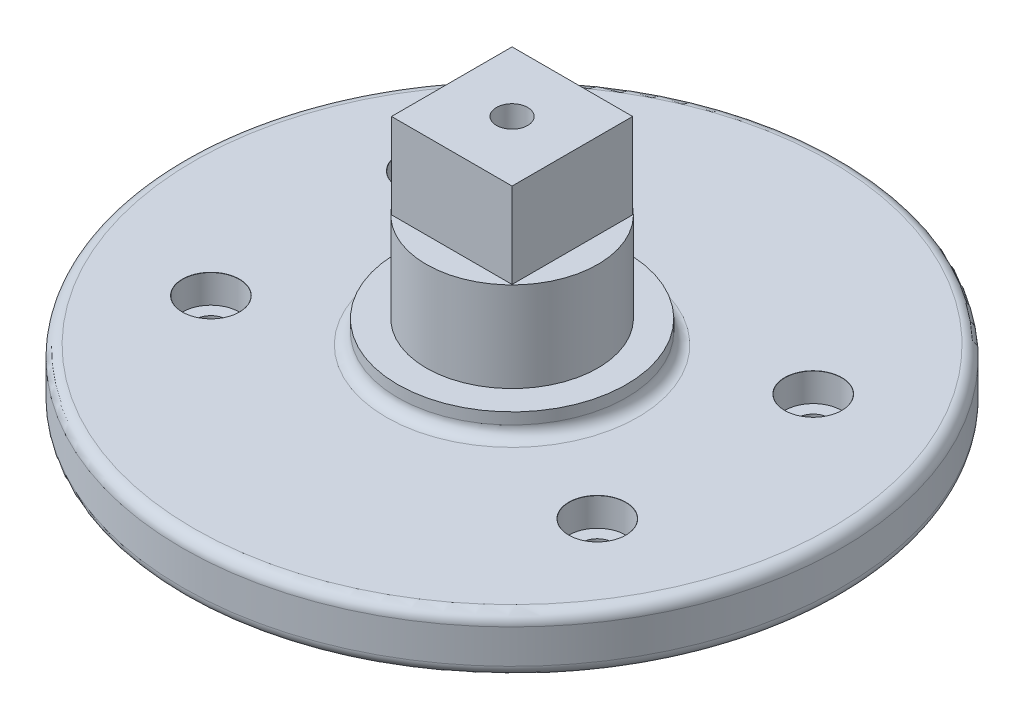
ISO-10303-21;
HEADER;
FILE_DESCRIPTION(('STEP AP214'),'2;1');
FILE_NAME('part.step','',(''),(''),'','','');
FILE_SCHEMA(('AUTOMOTIVE_DESIGN { 1 0 10303 214 1 1 1 1 }'));
ENDSEC;
DATA;
#1=APPLICATION_CONTEXT('core data for automotive mechanical design processes');
#2=APPLICATION_PROTOCOL_DEFINITION('international standard','automotive_design',2000,#1);
#3=PRODUCT_CONTEXT('',#1,'mechanical');
#4=PRODUCT('Part','Part','',(#3));
#5=PRODUCT_RELATED_PRODUCT_CATEGORY('part','',(#4));
#6=PRODUCT_DEFINITION_FORMATION('','',#4);
#7=PRODUCT_DEFINITION_CONTEXT('part definition',#1,'design');
#8=PRODUCT_DEFINITION('design','',#6,#7);
#9=PRODUCT_DEFINITION_SHAPE('','',#8);
#10=(LENGTH_UNIT() NAMED_UNIT(*) SI_UNIT(.MILLI.,.METRE.));
#11=(NAMED_UNIT(*) PLANE_ANGLE_UNIT() SI_UNIT($,.RADIAN.));
#12=(NAMED_UNIT(*) SI_UNIT($,.STERADIAN.) SOLID_ANGLE_UNIT());
#13=UNCERTAINTY_MEASURE_WITH_UNIT(LENGTH_MEASURE(1.E-05),#10,'distance_accuracy_value','');
#14=(GEOMETRIC_REPRESENTATION_CONTEXT(3) GLOBAL_UNCERTAINTY_ASSIGNED_CONTEXT((#13)) GLOBAL_UNIT_ASSIGNED_CONTEXT((#10,
#11,#12)) REPRESENTATION_CONTEXT('',''));
#15=CARTESIAN_POINT('',(0.,0.,0.));
#16=DIRECTION('',(0.,0.,1.));
#17=DIRECTION('',(1.,0.,0.));
#18=AXIS2_PLACEMENT_3D('',#15,#16,#17);
#19=CARTESIAN_POINT('',(0.,0.,0.));
#20=DIRECTION('',(0.,-1.,0.));
#21=DIRECTION('',(0.,0.,-1.));
#22=AXIS2_PLACEMENT_3D('',#19,#20,#21);
#23=CYLINDRICAL_SURFACE('',#22,2.74999999999999);
#24=CARTESIAN_POINT('',(0.,44.8,0.));
#25=DIRECTION('',(0.,-1.,0.));
#26=DIRECTION('',(0.,0.,-1.));
#27=AXIS2_PLACEMENT_3D('',#24,#25,#26);
#28=CIRCLE('',#27,2.74999999999999);
#29=CARTESIAN_POINT('',(0.,44.8,-2.74999999999999));
#30=VERTEX_POINT('',#29);
#31=EDGE_CURVE('E195',#30,#30,#28,.T.);
#32=ORIENTED_EDGE('',*,*,#31,.F.);
#33=EDGE_LOOP('',(#32));
#34=FACE_BOUND('',#33,.T.);
#35=CARTESIAN_POINT('',(0.,3.8,0.));
#36=DIRECTION('',(0.,-1.,0.));
#37=DIRECTION('',(0.,0.,-1.));
#38=AXIS2_PLACEMENT_3D('',#35,#36,#37);
#39=CIRCLE('',#38,2.74999999999999);
#40=CARTESIAN_POINT('',(0.,3.8,-2.74999999999999));
#41=VERTEX_POINT('',#40);
#42=EDGE_CURVE('E47',#41,#41,#39,.F.);
#43=ORIENTED_EDGE('',*,*,#42,.F.);
#44=EDGE_LOOP('',(#43));
#45=FACE_BOUND('',#44,.T.);
#46=ADVANCED_FACE('F43',(#34,#45),#23,.F.);
#47=CARTESIAN_POINT('',(0.,0.,0.));
#48=DIRECTION('',(0.,1.,0.));
#49=DIRECTION('',(0.,0.,1.));
#50=AXIS2_PLACEMENT_3D('',#47,#48,#49);
#51=PLANE('',#50);
#52=DIRECTION('',(-1.,0.,0.));
#53=VECTOR('',#52,1.);
#54=CARTESIAN_POINT('',(2.36713610367746,0.,4.1));
#55=LINE('',#54,#53);
#56=CARTESIAN_POINT('',(2.36713610367746,0.,4.1));
#57=VERTEX_POINT('',#56);
#58=CARTESIAN_POINT('',(-2.36713610367746,0.,4.1));
#59=VERTEX_POINT('',#58);
#60=EDGE_CURVE('E167',#57,#59,#55,.T.);
#61=ORIENTED_EDGE('',*,*,#60,.F.);
#62=DIRECTION('',(-0.5,0.,0.866025403784439));
#63=VECTOR('',#62,1.);
#64=CARTESIAN_POINT('',(4.73427220735493,0.,0.));
#65=LINE('',#64,#63);
#66=CARTESIAN_POINT('',(4.73427220735493,0.,0.));
#67=VERTEX_POINT('',#66);
#68=EDGE_CURVE('E60',#67,#57,#65,.T.);
#69=ORIENTED_EDGE('',*,*,#68,.F.);
#70=DIRECTION('',(0.5,0.,0.866025403784438));
#71=VECTOR('',#70,1.);
#72=CARTESIAN_POINT('',(2.36713610367746,0.,-4.1));
#73=LINE('',#72,#71);
#74=CARTESIAN_POINT('',(2.36713610367746,0.,-4.1));
#75=VERTEX_POINT('',#74);
#76=EDGE_CURVE('E147',#75,#67,#73,.T.);
#77=ORIENTED_EDGE('',*,*,#76,.F.);
#78=DIRECTION('',(1.,0.,0.));
#79=VECTOR('',#78,1.);
#80=CARTESIAN_POINT('',(-2.36713610367746,0.,-4.1));
#81=LINE('',#80,#79);
#82=CARTESIAN_POINT('',(-2.36713610367746,0.,-4.1));
#83=VERTEX_POINT('',#82);
#84=EDGE_CURVE('E151',#83,#75,#81,.T.);
#85=ORIENTED_EDGE('',*,*,#84,.F.);
#86=DIRECTION('',(0.5,0.,-0.866025403784438));
#87=VECTOR('',#86,1.);
#88=CARTESIAN_POINT('',(-4.73427220735493,0.,0.));
#89=LINE('',#88,#87);
#90=CARTESIAN_POINT('',(-4.73427220735493,0.,0.));
#91=VERTEX_POINT('',#90);
#92=EDGE_CURVE('E174',#91,#83,#89,.T.);
#93=ORIENTED_EDGE('',*,*,#92,.F.);
#94=DIRECTION('',(-0.5,0.,-0.866025403784439));
#95=VECTOR('',#94,1.);
#96=CARTESIAN_POINT('',(-2.36713610367746,0.,4.1));
#97=LINE('',#96,#95);
#98=EDGE_CURVE('E170',#59,#91,#97,.T.);
#99=ORIENTED_EDGE('',*,*,#98,.F.);
#100=EDGE_LOOP('',(#61,#69,#77,#85,#93,#99));
#101=FACE_BOUND('',#100,.T.);
#102=CARTESIAN_POINT('',(0.,0.,0.));
#103=DIRECTION('',(0.,1.,0.));
#104=DIRECTION('',(0.,0.,1.));
#105=AXIS2_PLACEMENT_3D('',#102,#103,#104);
#106=CIRCLE('',#105,56.);
#107=CARTESIAN_POINT('',(0.,0.,56.));
#108=VERTEX_POINT('',#107);
#109=EDGE_CURVE('E341',#108,#108,#106,.F.);
#110=ORIENTED_EDGE('',*,*,#109,.T.);
#111=EDGE_LOOP('',(#110));
#112=FACE_BOUND('',#111,.T.);
#113=CARTESIAN_POINT('',(-34.,0.,-19.));
#114=DIRECTION('',(0.,1.,0.));
#115=DIRECTION('',(0.,0.,1.));
#116=AXIS2_PLACEMENT_3D('',#113,#114,#115);
#117=CIRCLE('',#116,2.75);
#118=CARTESIAN_POINT('',(-34.,0.,-16.25));
#119=VERTEX_POINT('',#118);
#120=EDGE_CURVE('E271',#119,#119,#117,.T.);
#121=ORIENTED_EDGE('',*,*,#120,.T.);
#122=EDGE_LOOP('',(#121));
#123=FACE_BOUND('',#122,.T.);
#124=CARTESIAN_POINT('',(34.,0.,-19.));
#125=DIRECTION('',(0.,1.,0.));
#126=DIRECTION('',(0.,0.,1.));
#127=AXIS2_PLACEMENT_3D('',#124,#125,#126);
#128=CIRCLE('',#127,2.75);
#129=CARTESIAN_POINT('',(34.,0.,-16.25));
#130=VERTEX_POINT('',#129);
#131=EDGE_CURVE('E291',#130,#130,#128,.T.);
#132=ORIENTED_EDGE('',*,*,#131,.T.);
#133=EDGE_LOOP('',(#132));
#134=FACE_BOUND('',#133,.T.);
#135=CARTESIAN_POINT('',(-34.,0.,19.));
#136=DIRECTION('',(0.,1.,0.));
#137=DIRECTION('',(0.,0.,1.));
#138=AXIS2_PLACEMENT_3D('',#135,#136,#137);
#139=CIRCLE('',#138,2.75);
#140=CARTESIAN_POINT('',(-34.,0.,21.75));
#141=VERTEX_POINT('',#140);
#142=EDGE_CURVE('E311',#141,#141,#139,.T.);
#143=ORIENTED_EDGE('',*,*,#142,.T.);
#144=EDGE_LOOP('',(#143));
#145=FACE_BOUND('',#144,.T.);
#146=CARTESIAN_POINT('',(34.,0.,19.));
#147=DIRECTION('',(0.,1.,0.));
#148=DIRECTION('',(0.,0.,1.));
#149=AXIS2_PLACEMENT_3D('',#146,#147,#148);
#150=CIRCLE('',#149,2.75);
#151=CARTESIAN_POINT('',(34.,0.,21.75));
#152=VERTEX_POINT('',#151);
#153=EDGE_CURVE('E251',#152,#152,#150,.T.);
#154=ORIENTED_EDGE('',*,*,#153,.T.);
#155=EDGE_LOOP('',(#154));
#156=FACE_BOUND('',#155,.T.);
#157=ADVANCED_FACE('F371',(#101,#112,#123,#134,#145,#156),#51,.F.);
#158=CARTESIAN_POINT('',(0.,10.,0.));
#159=DIRECTION('',(0.,-1.,0.));
#160=DIRECTION('',(0.,0.,-1.));
#161=AXIS2_PLACEMENT_3D('',#158,#159,#160);
#162=CYLINDRICAL_SURFACE('',#161,58.);
#163=CARTESIAN_POINT('',(0.,2.,0.));
#164=DIRECTION('',(0.,1.,0.));
#165=DIRECTION('',(0.,0.,1.));
#166=AXIS2_PLACEMENT_3D('',#163,#164,#165);
#167=CIRCLE('',#166,58.);
#168=CARTESIAN_POINT('',(0.,2.,58.));
#169=VERTEX_POINT('',#168);
#170=EDGE_CURVE('E337',#169,#169,#167,.T.);
#171=ORIENTED_EDGE('',*,*,#170,.T.);
#172=EDGE_LOOP('',(#171));
#173=FACE_BOUND('',#172,.T.);
#174=CARTESIAN_POINT('',(0.,8.,0.));
#175=DIRECTION('',(0.,1.,0.));
#176=DIRECTION('',(0.,0.,1.));
#177=AXIS2_PLACEMENT_3D('',#174,#175,#176);
#178=CIRCLE('',#177,58.);
#179=CARTESIAN_POINT('',(0.,8.,58.));
#180=VERTEX_POINT('',#179);
#181=EDGE_CURVE('E250',#180,#180,#178,.F.);
#182=ORIENTED_EDGE('',*,*,#181,.T.);
#183=EDGE_LOOP('',(#182));
#184=FACE_BOUND('',#183,.T.);
#185=ADVANCED_FACE('F377',(#173,#184),#162,.T.);
#186=CARTESIAN_POINT('',(0.,10.,0.));
#187=DIRECTION('',(0.,1.,0.));
#188=DIRECTION('',(0.,0.,1.));
#189=AXIS2_PLACEMENT_3D('',#186,#187,#188);
#190=PLANE('',#189);
#191=CARTESIAN_POINT('',(0.,10.,0.));
#192=DIRECTION('',(0.,1.,0.));
#193=DIRECTION('',(0.,0.,1.));
#194=AXIS2_PLACEMENT_3D('',#191,#192,#193);
#195=CIRCLE('',#194,22.125);
#196=CARTESIAN_POINT('',(0.,10.,22.125));
#197=VERTEX_POINT('',#196);
#198=EDGE_CURVE('E11',#197,#197,#195,.F.);
#199=ORIENTED_EDGE('',*,*,#198,.T.);
#200=EDGE_LOOP('',(#199));
#201=FACE_BOUND('',#200,.T.);
#202=CARTESIAN_POINT('',(0.,10.,0.));
#203=DIRECTION('',(0.,1.,0.));
#204=DIRECTION('',(0.,0.,1.));
#205=AXIS2_PLACEMENT_3D('',#202,#203,#204);
#206=CIRCLE('',#205,56.);
#207=CARTESIAN_POINT('',(0.,10.,56.));
#208=VERTEX_POINT('',#207);
#209=EDGE_CURVE('E345',#208,#208,#206,.T.);
#210=ORIENTED_EDGE('',*,*,#209,.T.);
#211=EDGE_LOOP('',(#210));
#212=FACE_BOUND('',#211,.T.);
#213=CARTESIAN_POINT('',(-34.,10.,-19.));
#214=DIRECTION('',(0.,1.,0.));
#215=DIRECTION('',(0.,0.,1.));
#216=AXIS2_PLACEMENT_3D('',#213,#214,#215);
#217=CIRCLE('',#216,5.025);
#218=CARTESIAN_POINT('',(-34.,10.,-13.975));
#219=VERTEX_POINT('',#218);
#220=EDGE_CURVE('E255',#219,#219,#217,.T.);
#221=ORIENTED_EDGE('',*,*,#220,.F.);
#222=EDGE_LOOP('',(#221));
#223=FACE_BOUND('',#222,.T.);
#224=CARTESIAN_POINT('',(34.,10.,-19.));
#225=DIRECTION('',(0.,1.,0.));
#226=DIRECTION('',(0.,0.,1.));
#227=AXIS2_PLACEMENT_3D('',#224,#225,#226);
#228=CIRCLE('',#227,5.025);
#229=CARTESIAN_POINT('',(34.,10.,-13.975));
#230=VERTEX_POINT('',#229);
#231=EDGE_CURVE('E275',#230,#230,#228,.T.);
#232=ORIENTED_EDGE('',*,*,#231,.F.);
#233=EDGE_LOOP('',(#232));
#234=FACE_BOUND('',#233,.T.);
#235=CARTESIAN_POINT('',(-34.,10.,19.));
#236=DIRECTION('',(0.,1.,0.));
#237=DIRECTION('',(0.,0.,1.));
#238=AXIS2_PLACEMENT_3D('',#235,#236,#237);
#239=CIRCLE('',#238,5.025);
#240=CARTESIAN_POINT('',(-34.,10.,24.025));
#241=VERTEX_POINT('',#240);
#242=EDGE_CURVE('E295',#241,#241,#239,.T.);
#243=ORIENTED_EDGE('',*,*,#242,.F.);
#244=EDGE_LOOP('',(#243));
#245=FACE_BOUND('',#244,.T.);
#246=CARTESIAN_POINT('',(34.,10.,19.));
#247=DIRECTION('',(0.,1.,0.));
#248=DIRECTION('',(0.,0.,1.));
#249=AXIS2_PLACEMENT_3D('',#246,#247,#248);
#250=CIRCLE('',#249,5.025);
#251=CARTESIAN_POINT('',(34.,10.,24.025));
#252=VERTEX_POINT('',#251);
#253=EDGE_CURVE('E315',#252,#252,#250,.T.);
#254=ORIENTED_EDGE('',*,*,#253,.F.);
#255=EDGE_LOOP('',(#254));
#256=FACE_BOUND('',#255,.T.);
#257=ADVANCED_FACE('F476',(#201,#212,#223,#234,#245,#256),#190,.T.);
#258=CARTESIAN_POINT('',(34.,10.,19.));
#259=DIRECTION('',(0.,1.,0.));
#260=DIRECTION('',(0.,0.,1.));
#261=AXIS2_PLACEMENT_3D('',#258,#259,#260);
#262=CYLINDRICAL_SURFACE('',#261,2.75);
#263=ORIENTED_EDGE('',*,*,#153,.F.);
#264=EDGE_LOOP('',(#263));
#265=FACE_BOUND('',#264,.T.);
#266=CARTESIAN_POINT('',(34.,5.,19.));
#267=DIRECTION('',(0.,1.,0.));
#268=DIRECTION('',(0.,0.,1.));
#269=AXIS2_PLACEMENT_3D('',#266,#267,#268);
#270=CIRCLE('',#269,2.75);
#271=CARTESIAN_POINT('',(34.,5.,21.75));
#272=VERTEX_POINT('',#271);
#273=EDGE_CURVE('E327',#272,#272,#270,.T.);
#274=ORIENTED_EDGE('',*,*,#273,.T.);
#275=EDGE_LOOP('',(#274));
#276=FACE_BOUND('',#275,.T.);
#277=ADVANCED_FACE('F472',(#265,#276),#262,.F.);
#278=CARTESIAN_POINT('',(39.,5.,19.));
#279=DIRECTION('',(0.,-1.,0.));
#280=DIRECTION('',(0.,0.,-1.));
#281=AXIS2_PLACEMENT_3D('',#278,#279,#280);
#282=PLANE('',#281);
#283=ORIENTED_EDGE('',*,*,#273,.F.);
#284=EDGE_LOOP('',(#283));
#285=FACE_BOUND('',#284,.T.);
#286=CARTESIAN_POINT('',(34.,5.,19.));
#287=DIRECTION('',(0.,1.,0.));
#288=DIRECTION('',(0.,0.,1.));
#289=AXIS2_PLACEMENT_3D('',#286,#287,#288);
#290=CIRCLE('',#289,5.);
#291=CARTESIAN_POINT('',(34.,5.,24.));
#292=VERTEX_POINT('',#291);
#293=EDGE_CURVE('E323',#292,#292,#290,.T.);
#294=ORIENTED_EDGE('',*,*,#293,.T.);
#295=EDGE_LOOP('',(#294));
#296=FACE_BOUND('',#295,.T.);
#297=ADVANCED_FACE('F468',(#285,#296),#282,.F.);
#298=CARTESIAN_POINT('',(34.,10.,19.));
#299=DIRECTION('',(0.,1.,0.));
#300=DIRECTION('',(0.,0.,1.));
#301=AXIS2_PLACEMENT_3D('',#298,#299,#300);
#302=CYLINDRICAL_SURFACE('',#301,5.);
#303=ORIENTED_EDGE('',*,*,#293,.F.);
#304=EDGE_LOOP('',(#303));
#305=FACE_BOUND('',#304,.T.);
#306=CARTESIAN_POINT('',(34.,9.975,19.));
#307=DIRECTION('',(0.,1.,0.));
#308=DIRECTION('',(0.,0.,1.));
#309=AXIS2_PLACEMENT_3D('',#306,#307,#308);
#310=CIRCLE('',#309,5.);
#311=CARTESIAN_POINT('',(34.,9.975,24.));
#312=VERTEX_POINT('',#311);
#313=EDGE_CURVE('E319',#312,#312,#310,.T.);
#314=ORIENTED_EDGE('',*,*,#313,.T.);
#315=EDGE_LOOP('',(#314));
#316=FACE_BOUND('',#315,.T.);
#317=ADVANCED_FACE('F464',(#305,#316),#302,.F.);
#318=CARTESIAN_POINT('',(34.,10.,19.));
#319=DIRECTION('',(0.,1.,0.));
#320=DIRECTION('',(0.,0.,1.));
#321=AXIS2_PLACEMENT_3D('',#318,#319,#320);
#322=CONICAL_SURFACE('',#321,5.025,0.785398163397518);
#323=ORIENTED_EDGE('',*,*,#313,.F.);
#324=EDGE_LOOP('',(#323));
#325=FACE_BOUND('',#324,.T.);
#326=ORIENTED_EDGE('',*,*,#253,.T.);
#327=EDGE_LOOP('',(#326));
#328=FACE_BOUND('',#327,.T.);
#329=ADVANCED_FACE('F460',(#325,#328),#322,.F.);
#330=CARTESIAN_POINT('',(-34.,10.,19.));
#331=DIRECTION('',(0.,1.,0.));
#332=DIRECTION('',(0.,0.,1.));
#333=AXIS2_PLACEMENT_3D('',#330,#331,#332);
#334=CYLINDRICAL_SURFACE('',#333,2.75);
#335=ORIENTED_EDGE('',*,*,#142,.F.);
#336=EDGE_LOOP('',(#335));
#337=FACE_BOUND('',#336,.T.);
#338=CARTESIAN_POINT('',(-34.,5.,19.));
#339=DIRECTION('',(0.,1.,0.));
#340=DIRECTION('',(0.,0.,1.));
#341=AXIS2_PLACEMENT_3D('',#338,#339,#340);
#342=CIRCLE('',#341,2.75);
#343=CARTESIAN_POINT('',(-34.,5.,21.75));
#344=VERTEX_POINT('',#343);
#345=EDGE_CURVE('E307',#344,#344,#342,.T.);
#346=ORIENTED_EDGE('',*,*,#345,.T.);
#347=EDGE_LOOP('',(#346));
#348=FACE_BOUND('',#347,.T.);
#349=ADVANCED_FACE('F456',(#337,#348),#334,.F.);
#350=CARTESIAN_POINT('',(-29.,5.,19.));
#351=DIRECTION('',(0.,-1.,0.));
#352=DIRECTION('',(0.,0.,-1.));
#353=AXIS2_PLACEMENT_3D('',#350,#351,#352);
#354=PLANE('',#353);
#355=ORIENTED_EDGE('',*,*,#345,.F.);
#356=EDGE_LOOP('',(#355));
#357=FACE_BOUND('',#356,.T.);
#358=CARTESIAN_POINT('',(-34.,5.,19.));
#359=DIRECTION('',(0.,1.,0.));
#360=DIRECTION('',(0.,0.,1.));
#361=AXIS2_PLACEMENT_3D('',#358,#359,#360);
#362=CIRCLE('',#361,5.);
#363=CARTESIAN_POINT('',(-34.,5.,24.));
#364=VERTEX_POINT('',#363);
#365=EDGE_CURVE('E303',#364,#364,#362,.T.);
#366=ORIENTED_EDGE('',*,*,#365,.T.);
#367=EDGE_LOOP('',(#366));
#368=FACE_BOUND('',#367,.T.);
#369=ADVANCED_FACE('F452',(#357,#368),#354,.F.);
#370=CARTESIAN_POINT('',(-34.,10.,19.));
#371=DIRECTION('',(0.,1.,0.));
#372=DIRECTION('',(0.,0.,1.));
#373=AXIS2_PLACEMENT_3D('',#370,#371,#372);
#374=CYLINDRICAL_SURFACE('',#373,5.);
#375=ORIENTED_EDGE('',*,*,#365,.F.);
#376=EDGE_LOOP('',(#375));
#377=FACE_BOUND('',#376,.T.);
#378=CARTESIAN_POINT('',(-34.,9.975,19.));
#379=DIRECTION('',(0.,1.,0.));
#380=DIRECTION('',(0.,0.,1.));
#381=AXIS2_PLACEMENT_3D('',#378,#379,#380);
#382=CIRCLE('',#381,5.);
#383=CARTESIAN_POINT('',(-34.,9.975,24.));
#384=VERTEX_POINT('',#383);
#385=EDGE_CURVE('E299',#384,#384,#382,.T.);
#386=ORIENTED_EDGE('',*,*,#385,.T.);
#387=EDGE_LOOP('',(#386));
#388=FACE_BOUND('',#387,.T.);
#389=ADVANCED_FACE('F448',(#377,#388),#374,.F.);
#390=CARTESIAN_POINT('',(-34.,10.,19.));
#391=DIRECTION('',(0.,1.,0.));
#392=DIRECTION('',(0.,0.,1.));
#393=AXIS2_PLACEMENT_3D('',#390,#391,#392);
#394=CONICAL_SURFACE('',#393,5.025,0.785398163397518);
#395=ORIENTED_EDGE('',*,*,#385,.F.);
#396=EDGE_LOOP('',(#395));
#397=FACE_BOUND('',#396,.T.);
#398=ORIENTED_EDGE('',*,*,#242,.T.);
#399=EDGE_LOOP('',(#398));
#400=FACE_BOUND('',#399,.T.);
#401=ADVANCED_FACE('F444',(#397,#400),#394,.F.);
#402=CARTESIAN_POINT('',(34.,10.,-19.));
#403=DIRECTION('',(0.,1.,0.));
#404=DIRECTION('',(0.,0.,1.));
#405=AXIS2_PLACEMENT_3D('',#402,#403,#404);
#406=CYLINDRICAL_SURFACE('',#405,2.75);
#407=ORIENTED_EDGE('',*,*,#131,.F.);
#408=EDGE_LOOP('',(#407));
#409=FACE_BOUND('',#408,.T.);
#410=CARTESIAN_POINT('',(34.,5.,-19.));
#411=DIRECTION('',(0.,1.,0.));
#412=DIRECTION('',(0.,0.,1.));
#413=AXIS2_PLACEMENT_3D('',#410,#411,#412);
#414=CIRCLE('',#413,2.75);
#415=CARTESIAN_POINT('',(34.,5.,-16.25));
#416=VERTEX_POINT('',#415);
#417=EDGE_CURVE('E287',#416,#416,#414,.T.);
#418=ORIENTED_EDGE('',*,*,#417,.T.);
#419=EDGE_LOOP('',(#418));
#420=FACE_BOUND('',#419,.T.);
#421=ADVANCED_FACE('F440',(#409,#420),#406,.F.);
#422=CARTESIAN_POINT('',(39.,5.,-19.));
#423=DIRECTION('',(0.,-1.,0.));
#424=DIRECTION('',(0.,0.,-1.));
#425=AXIS2_PLACEMENT_3D('',#422,#423,#424);
#426=PLANE('',#425);
#427=ORIENTED_EDGE('',*,*,#417,.F.);
#428=EDGE_LOOP('',(#427));
#429=FACE_BOUND('',#428,.T.);
#430=CARTESIAN_POINT('',(34.,5.,-19.));
#431=DIRECTION('',(0.,1.,0.));
#432=DIRECTION('',(0.,0.,1.));
#433=AXIS2_PLACEMENT_3D('',#430,#431,#432);
#434=CIRCLE('',#433,5.);
#435=CARTESIAN_POINT('',(34.,5.,-14.));
#436=VERTEX_POINT('',#435);
#437=EDGE_CURVE('E283',#436,#436,#434,.T.);
#438=ORIENTED_EDGE('',*,*,#437,.T.);
#439=EDGE_LOOP('',(#438));
#440=FACE_BOUND('',#439,.T.);
#441=ADVANCED_FACE('F436',(#429,#440),#426,.F.);
#442=CARTESIAN_POINT('',(34.,10.,-19.));
#443=DIRECTION('',(0.,1.,0.));
#444=DIRECTION('',(0.,0.,1.));
#445=AXIS2_PLACEMENT_3D('',#442,#443,#444);
#446=CYLINDRICAL_SURFACE('',#445,5.);
#447=ORIENTED_EDGE('',*,*,#437,.F.);
#448=EDGE_LOOP('',(#447));
#449=FACE_BOUND('',#448,.T.);
#450=CARTESIAN_POINT('',(34.,9.975,-19.));
#451=DIRECTION('',(0.,1.,0.));
#452=DIRECTION('',(0.,0.,1.));
#453=AXIS2_PLACEMENT_3D('',#450,#451,#452);
#454=CIRCLE('',#453,5.);
#455=CARTESIAN_POINT('',(34.,9.975,-14.));
#456=VERTEX_POINT('',#455);
#457=EDGE_CURVE('E279',#456,#456,#454,.T.);
#458=ORIENTED_EDGE('',*,*,#457,.T.);
#459=EDGE_LOOP('',(#458));
#460=FACE_BOUND('',#459,.T.);
#461=ADVANCED_FACE('F432',(#449,#460),#446,.F.);
#462=CARTESIAN_POINT('',(34.,10.,-19.));
#463=DIRECTION('',(0.,1.,0.));
#464=DIRECTION('',(0.,0.,1.));
#465=AXIS2_PLACEMENT_3D('',#462,#463,#464);
#466=CONICAL_SURFACE('',#465,5.025,0.785398163397518);
#467=ORIENTED_EDGE('',*,*,#457,.F.);
#468=EDGE_LOOP('',(#467));
#469=FACE_BOUND('',#468,.T.);
#470=ORIENTED_EDGE('',*,*,#231,.T.);
#471=EDGE_LOOP('',(#470));
#472=FACE_BOUND('',#471,.T.);
#473=ADVANCED_FACE('F428',(#469,#472),#466,.F.);
#474=CARTESIAN_POINT('',(-34.,10.,-19.));
#475=DIRECTION('',(0.,1.,0.));
#476=DIRECTION('',(0.,0.,1.));
#477=AXIS2_PLACEMENT_3D('',#474,#475,#476);
#478=CYLINDRICAL_SURFACE('',#477,2.75);
#479=ORIENTED_EDGE('',*,*,#120,.F.);
#480=EDGE_LOOP('',(#479));
#481=FACE_BOUND('',#480,.T.);
#482=CARTESIAN_POINT('',(-34.,5.,-19.));
#483=DIRECTION('',(0.,1.,0.));
#484=DIRECTION('',(0.,0.,1.));
#485=AXIS2_PLACEMENT_3D('',#482,#483,#484);
#486=CIRCLE('',#485,2.75);
#487=CARTESIAN_POINT('',(-34.,5.,-16.25));
#488=VERTEX_POINT('',#487);
#489=EDGE_CURVE('E267',#488,#488,#486,.T.);
#490=ORIENTED_EDGE('',*,*,#489,.T.);
#491=EDGE_LOOP('',(#490));
#492=FACE_BOUND('',#491,.T.);
#493=ADVANCED_FACE('F424',(#481,#492),#478,.F.);
#494=CARTESIAN_POINT('',(-29.,5.,-19.));
#495=DIRECTION('',(0.,-1.,0.));
#496=DIRECTION('',(0.,0.,-1.));
#497=AXIS2_PLACEMENT_3D('',#494,#495,#496);
#498=PLANE('',#497);
#499=ORIENTED_EDGE('',*,*,#489,.F.);
#500=EDGE_LOOP('',(#499));
#501=FACE_BOUND('',#500,.T.);
#502=CARTESIAN_POINT('',(-34.,5.,-19.));
#503=DIRECTION('',(0.,1.,0.));
#504=DIRECTION('',(0.,0.,1.));
#505=AXIS2_PLACEMENT_3D('',#502,#503,#504);
#506=CIRCLE('',#505,5.);
#507=CARTESIAN_POINT('',(-34.,5.,-14.));
#508=VERTEX_POINT('',#507);
#509=EDGE_CURVE('E263',#508,#508,#506,.T.);
#510=ORIENTED_EDGE('',*,*,#509,.T.);
#511=EDGE_LOOP('',(#510));
#512=FACE_BOUND('',#511,.T.);
#513=ADVANCED_FACE('F420',(#501,#512),#498,.F.);
#514=CARTESIAN_POINT('',(-34.,10.,-19.));
#515=DIRECTION('',(0.,1.,0.));
#516=DIRECTION('',(0.,0.,1.));
#517=AXIS2_PLACEMENT_3D('',#514,#515,#516);
#518=CYLINDRICAL_SURFACE('',#517,5.);
#519=ORIENTED_EDGE('',*,*,#509,.F.);
#520=EDGE_LOOP('',(#519));
#521=FACE_BOUND('',#520,.T.);
#522=CARTESIAN_POINT('',(-34.,9.975,-19.));
#523=DIRECTION('',(0.,1.,0.));
#524=DIRECTION('',(0.,0.,1.));
#525=AXIS2_PLACEMENT_3D('',#522,#523,#524);
#526=CIRCLE('',#525,5.);
#527=CARTESIAN_POINT('',(-34.,9.975,-14.));
#528=VERTEX_POINT('',#527);
#529=EDGE_CURVE('E259',#528,#528,#526,.T.);
#530=ORIENTED_EDGE('',*,*,#529,.T.);
#531=EDGE_LOOP('',(#530));
#532=FACE_BOUND('',#531,.T.);
#533=ADVANCED_FACE('F416',(#521,#532),#518,.F.);
#534=CARTESIAN_POINT('',(-34.,10.,-19.));
#535=DIRECTION('',(0.,1.,0.));
#536=DIRECTION('',(0.,0.,1.));
#537=AXIS2_PLACEMENT_3D('',#534,#535,#536);
#538=CONICAL_SURFACE('',#537,5.025,0.785398163397518);
#539=ORIENTED_EDGE('',*,*,#529,.F.);
#540=EDGE_LOOP('',(#539));
#541=FACE_BOUND('',#540,.T.);
#542=ORIENTED_EDGE('',*,*,#220,.T.);
#543=EDGE_LOOP('',(#542));
#544=FACE_BOUND('',#543,.T.);
#545=ADVANCED_FACE('F413',(#541,#544),#538,.F.);
#546=CARTESIAN_POINT('',(0.,14.,0.));
#547=DIRECTION('',(0.,-1.,0.));
#548=DIRECTION('',(0.,0.,-1.));
#549=AXIS2_PLACEMENT_3D('',#546,#547,#548);
#550=CYLINDRICAL_SURFACE('',#549,20.125);
#551=CARTESIAN_POINT('',(0.,12.,0.));
#552=DIRECTION('',(0.,1.,0.));
#553=DIRECTION('',(0.,0.,1.));
#554=AXIS2_PLACEMENT_3D('',#551,#552,#553);
#555=CIRCLE('',#554,20.125);
#556=CARTESIAN_POINT('',(0.,12.,20.125));
#557=VERTEX_POINT('',#556);
#558=EDGE_CURVE('E53',#557,#557,#555,.T.);
#559=ORIENTED_EDGE('',*,*,#558,.T.);
#560=EDGE_LOOP('',(#559));
#561=FACE_BOUND('',#560,.T.);
#562=CARTESIAN_POINT('',(0.,14.,0.));
#563=DIRECTION('',(0.,1.,0.));
#564=DIRECTION('',(0.,0.,1.));
#565=AXIS2_PLACEMENT_3D('',#562,#563,#564);
#566=CIRCLE('',#565,20.125);
#567=CARTESIAN_POINT('',(0.,14.,20.125));
#568=VERTEX_POINT('',#567);
#569=EDGE_CURVE('E245',#568,#568,#566,.T.);
#570=ORIENTED_EDGE('',*,*,#569,.F.);
#571=EDGE_LOOP('',(#570));
#572=FACE_BOUND('',#571,.T.);
#573=ADVANCED_FACE('F353',(#561,#572),#550,.T.);
#574=CARTESIAN_POINT('',(0.,14.,0.));
#575=DIRECTION('',(0.,1.,0.));
#576=DIRECTION('',(0.,0.,1.));
#577=AXIS2_PLACEMENT_3D('',#574,#575,#576);
#578=PLANE('',#577);
#579=CARTESIAN_POINT('',(0.,14.,0.));
#580=DIRECTION('',(0.,1.,0.));
#581=DIRECTION('',(0.,0.,1.));
#582=AXIS2_PLACEMENT_3D('',#579,#580,#581);
#583=CIRCLE('',#582,15.1);
#584=CARTESIAN_POINT('',(0.,14.,15.1));
#585=VERTEX_POINT('',#584);
#586=EDGE_CURVE('E246',#585,#585,#583,.T.);
#587=ORIENTED_EDGE('',*,*,#586,.F.);
#588=EDGE_LOOP('',(#587));
#589=FACE_BOUND('',#588,.T.);
#590=ORIENTED_EDGE('',*,*,#569,.T.);
#591=EDGE_LOOP('',(#590));
#592=FACE_BOUND('',#591,.T.);
#593=ADVANCED_FACE('F406',(#589,#592),#578,.T.);
#594=CARTESIAN_POINT('',(0.,29.8,0.));
#595=DIRECTION('',(0.,-1.,0.));
#596=DIRECTION('',(0.,0.,-1.));
#597=AXIS2_PLACEMENT_3D('',#594,#595,#596);
#598=CYLINDRICAL_SURFACE('',#597,15.1);
#599=CARTESIAN_POINT('',(0.,29.8,0.));
#600=DIRECTION('',(0.,1.,0.));
#601=DIRECTION('',(0.,0.,1.));
#602=AXIS2_PLACEMENT_3D('',#599,#600,#601);
#603=CIRCLE('',#602,15.1);
#604=CARTESIAN_POINT('',(0.,29.8,15.1));
#605=VERTEX_POINT('',#604);
#606=EDGE_CURVE('E241',#605,#605,#603,.T.);
#607=ORIENTED_EDGE('',*,*,#606,.F.);
#608=EDGE_LOOP('',(#607));
#609=FACE_BOUND('',#608,.T.);
#610=ORIENTED_EDGE('',*,*,#586,.T.);
#611=EDGE_LOOP('',(#610));
#612=FACE_BOUND('',#611,.T.);
#613=ADVANCED_FACE('F403',(#609,#612),#598,.T.);
#614=CARTESIAN_POINT('',(0.,29.8,0.));
#615=DIRECTION('',(0.,1.,0.));
#616=DIRECTION('',(0.,0.,1.));
#617=AXIS2_PLACEMENT_3D('',#614,#615,#616);
#618=PLANE('',#617);
#619=DIRECTION('',(0.,0.,-1.));
#620=VECTOR('',#619,1.);
#621=CARTESIAN_POINT('',(10.6066017177982,29.8,10.6066017177982));
#622=LINE('',#621,#620);
#623=CARTESIAN_POINT('',(10.6066017177982,29.8,10.6066017177982));
#624=VERTEX_POINT('',#623);
#625=CARTESIAN_POINT('',(10.6066017177982,29.8,-10.6066017177982));
#626=VERTEX_POINT('',#625);
#627=EDGE_CURVE('E68',#624,#626,#622,.T.);
#628=ORIENTED_EDGE('',*,*,#627,.F.);
#629=DIRECTION('',(1.,0.,0.));
#630=VECTOR('',#629,1.);
#631=CARTESIAN_POINT('',(-10.6066017177982,29.8,10.6066017177982));
#632=LINE('',#631,#630);
#633=CARTESIAN_POINT('',(-10.6066017177982,29.8,10.6066017177982));
#634=VERTEX_POINT('',#633);
#635=EDGE_CURVE('E204',#634,#624,#632,.T.);
#636=ORIENTED_EDGE('',*,*,#635,.F.);
#637=DIRECTION('',(0.,0.,1.));
#638=VECTOR('',#637,1.);
#639=CARTESIAN_POINT('',(-10.6066017177982,29.8,10.6066017177982));
#640=LINE('',#639,#638);
#641=CARTESIAN_POINT('',(-10.6066017177982,29.8,-10.6066017177982));
#642=VERTEX_POINT('',#641);
#643=EDGE_CURVE('E220',#642,#634,#640,.T.);
#644=ORIENTED_EDGE('',*,*,#643,.F.);
#645=DIRECTION('',(-1.,0.,0.));
#646=VECTOR('',#645,1.);
#647=CARTESIAN_POINT('',(-10.6066017177982,29.8,-10.6066017177982));
#648=LINE('',#647,#646);
#649=EDGE_CURVE('E216',#626,#642,#648,.T.);
#650=ORIENTED_EDGE('',*,*,#649,.F.);
#651=EDGE_LOOP('',(#628,#636,#644,#650));
#652=FACE_BOUND('',#651,.T.);
#653=ORIENTED_EDGE('',*,*,#606,.T.);
#654=EDGE_LOOP('',(#653));
#655=FACE_BOUND('',#654,.T.);
#656=ADVANCED_FACE('F400',(#652,#655),#618,.T.);
#657=CARTESIAN_POINT('',(0.,2.,0.));
#658=DIRECTION('',(0.,1.,0.));
#659=DIRECTION('',(0.,0.,1.));
#660=AXIS2_PLACEMENT_3D('',#657,#658,#659);
#661=TOROIDAL_SURFACE('',#660,56.,2.);
#662=ORIENTED_EDGE('',*,*,#109,.F.);
#663=EDGE_LOOP('',(#662));
#664=FACE_BOUND('',#663,.T.);
#665=ORIENTED_EDGE('',*,*,#170,.F.);
#666=EDGE_LOOP('',(#665));
#667=FACE_BOUND('',#666,.T.);
#668=ADVANCED_FACE('F367',(#664,#667),#661,.T.);
#669=CARTESIAN_POINT('',(0.,8.,0.));
#670=DIRECTION('',(0.,1.,0.));
#671=DIRECTION('',(0.,0.,1.));
#672=AXIS2_PLACEMENT_3D('',#669,#670,#671);
#673=TOROIDAL_SURFACE('',#672,56.,2.);
#674=ORIENTED_EDGE('',*,*,#181,.F.);
#675=EDGE_LOOP('',(#674));
#676=FACE_BOUND('',#675,.T.);
#677=ORIENTED_EDGE('',*,*,#209,.F.);
#678=EDGE_LOOP('',(#677));
#679=FACE_BOUND('',#678,.T.);
#680=ADVANCED_FACE('F358',(#676,#679),#673,.T.);
#681=CARTESIAN_POINT('',(0.,12.,0.));
#682=DIRECTION('',(0.,1.,0.));
#683=DIRECTION('',(0.,0.,1.));
#684=AXIS2_PLACEMENT_3D('',#681,#682,#683);
#685=TOROIDAL_SURFACE('',#684,22.125,2.);
#686=ORIENTED_EDGE('',*,*,#198,.F.);
#687=EDGE_LOOP('',(#686));
#688=FACE_BOUND('',#687,.T.);
#689=ORIENTED_EDGE('',*,*,#558,.F.);
#690=EDGE_LOOP('',(#689));
#691=FACE_BOUND('',#690,.T.);
#692=ADVANCED_FACE('F45',(#688,#691),#685,.F.);
#693=CARTESIAN_POINT('',(10.6066017177982,44.8,10.6066017177982));
#694=DIRECTION('',(-1.,0.,0.));
#695=DIRECTION('',(0.,0.,1.));
#696=AXIS2_PLACEMENT_3D('',#693,#694,#695);
#697=PLANE('',#696);
#698=ORIENTED_EDGE('',*,*,#627,.T.);
#699=DIRECTION('',(0.,-1.,0.));
#700=VECTOR('',#699,1.);
#701=CARTESIAN_POINT('',(10.6066017177982,44.8,-10.6066017177982));
#702=LINE('',#701,#700);
#703=CARTESIAN_POINT('',(10.6066017177982,44.8,-10.6066017177982));
#704=VERTEX_POINT('',#703);
#705=EDGE_CURVE('E237',#704,#626,#702,.T.);
#706=ORIENTED_EDGE('',*,*,#705,.F.);
#707=DIRECTION('',(0.,0.,-1.));
#708=VECTOR('',#707,1.);
#709=CARTESIAN_POINT('',(10.6066017177982,44.8,10.6066017177982));
#710=LINE('',#709,#708);
#711=CARTESIAN_POINT('',(10.6066017177982,44.8,10.6066017177982));
#712=VERTEX_POINT('',#711);
#713=EDGE_CURVE('E199',#712,#704,#710,.T.);
#714=ORIENTED_EDGE('',*,*,#713,.F.);
#715=DIRECTION('',(0.,-1.,0.));
#716=VECTOR('',#715,1.);
#717=CARTESIAN_POINT('',(10.6066017177982,44.8,10.6066017177982));
#718=LINE('',#717,#716);
#719=EDGE_CURVE('E213',#712,#624,#718,.T.);
#720=ORIENTED_EDGE('',*,*,#719,.T.);
#721=EDGE_LOOP('',(#698,#706,#714,#720));
#722=FACE_BOUND('',#721,.T.);
#723=ADVANCED_FACE('F357',(#722),#697,.F.);
#724=CARTESIAN_POINT('',(-10.6066017177982,44.8,-10.6066017177982));
#725=DIRECTION('',(0.,0.,1.));
#726=DIRECTION('',(1.,0.,0.));
#727=AXIS2_PLACEMENT_3D('',#724,#725,#726);
#728=PLANE('',#727);
#729=ORIENTED_EDGE('',*,*,#649,.T.);
#730=DIRECTION('',(0.,-1.,0.));
#731=VECTOR('',#730,1.);
#732=CARTESIAN_POINT('',(-10.6066017177982,44.8,-10.6066017177982));
#733=LINE('',#732,#731);
#734=CARTESIAN_POINT('',(-10.6066017177982,44.8,-10.6066017177982));
#735=VERTEX_POINT('',#734);
#736=EDGE_CURVE('E233',#735,#642,#733,.T.);
#737=ORIENTED_EDGE('',*,*,#736,.F.);
#738=DIRECTION('',(-1.,0.,0.));
#739=VECTOR('',#738,1.);
#740=CARTESIAN_POINT('',(-10.6066017177982,44.8,-10.6066017177982));
#741=LINE('',#740,#739);
#742=EDGE_CURVE('E203',#704,#735,#741,.T.);
#743=ORIENTED_EDGE('',*,*,#742,.F.);
#744=ORIENTED_EDGE('',*,*,#705,.T.);
#745=EDGE_LOOP('',(#729,#737,#743,#744));
#746=FACE_BOUND('',#745,.T.);
#747=ADVANCED_FACE('F364',(#746),#728,.F.);
#748=CARTESIAN_POINT('',(-10.6066017177982,44.8,10.6066017177982));
#749=DIRECTION('',(1.,0.,0.));
#750=DIRECTION('',(0.,0.,-1.));
#751=AXIS2_PLACEMENT_3D('',#748,#749,#750);
#752=PLANE('',#751);
#753=ORIENTED_EDGE('',*,*,#643,.T.);
#754=DIRECTION('',(0.,-1.,0.));
#755=VECTOR('',#754,1.);
#756=CARTESIAN_POINT('',(-10.6066017177982,44.8,10.6066017177982));
#757=LINE('',#756,#755);
#758=CARTESIAN_POINT('',(-10.6066017177982,44.8,10.6066017177982));
#759=VERTEX_POINT('',#758);
#760=EDGE_CURVE('E229',#759,#634,#757,.T.);
#761=ORIENTED_EDGE('',*,*,#760,.F.);
#762=DIRECTION('',(0.,0.,1.));
#763=VECTOR('',#762,1.);
#764=CARTESIAN_POINT('',(-10.6066017177982,44.8,10.6066017177982));
#765=LINE('',#764,#763);
#766=EDGE_CURVE('E207',#735,#759,#765,.T.);
#767=ORIENTED_EDGE('',*,*,#766,.F.);
#768=ORIENTED_EDGE('',*,*,#736,.T.);
#769=EDGE_LOOP('',(#753,#761,#767,#768));
#770=FACE_BOUND('',#769,.T.);
#771=ADVANCED_FACE('F392',(#770),#752,.F.);
#772=CARTESIAN_POINT('',(-10.6066017177982,44.8,10.6066017177982));
#773=DIRECTION('',(0.,0.,-1.));
#774=DIRECTION('',(-1.,0.,0.));
#775=AXIS2_PLACEMENT_3D('',#772,#773,#774);
#776=PLANE('',#775);
#777=ORIENTED_EDGE('',*,*,#635,.T.);
#778=ORIENTED_EDGE('',*,*,#719,.F.);
#779=DIRECTION('',(1.,0.,0.));
#780=VECTOR('',#779,1.);
#781=CARTESIAN_POINT('',(-10.6066017177982,44.8,10.6066017177982));
#782=LINE('',#781,#780);
#783=EDGE_CURVE('E210',#759,#712,#782,.T.);
#784=ORIENTED_EDGE('',*,*,#783,.F.);
#785=ORIENTED_EDGE('',*,*,#760,.T.);
#786=EDGE_LOOP('',(#777,#778,#784,#785));
#787=FACE_BOUND('',#786,.T.);
#788=ADVANCED_FACE('F388',(#787),#776,.F.);
#789=CARTESIAN_POINT('',(0.,44.8,0.));
#790=DIRECTION('',(0.,-1.,0.));
#791=DIRECTION('',(0.,0.,-1.));
#792=AXIS2_PLACEMENT_3D('',#789,#790,#791);
#793=PLANE('',#792);
#794=ORIENTED_EDGE('',*,*,#31,.T.);
#795=EDGE_LOOP('',(#794));
#796=FACE_BOUND('',#795,.T.);
#797=ORIENTED_EDGE('',*,*,#713,.T.);
#798=ORIENTED_EDGE('',*,*,#742,.T.);
#799=ORIENTED_EDGE('',*,*,#766,.T.);
#800=ORIENTED_EDGE('',*,*,#783,.T.);
#801=EDGE_LOOP('',(#797,#798,#799,#800));
#802=FACE_BOUND('',#801,.T.);
#803=ADVANCED_FACE('F385',(#796,#802),#793,.F.);
#804=CARTESIAN_POINT('',(0.,3.8,0.));
#805=DIRECTION('',(0.,-1.,0.));
#806=DIRECTION('',(0.,0.,-1.));
#807=AXIS2_PLACEMENT_3D('',#804,#805,#806);
#808=PLANE('',#807);
#809=DIRECTION('',(-0.5,0.,0.866025403784439));
#810=VECTOR('',#809,1.);
#811=CARTESIAN_POINT('',(4.73427220735493,3.8,0.));
#812=LINE('',#811,#810);
#813=CARTESIAN_POINT('',(4.73427220735493,3.8,0.));
#814=VERTEX_POINT('',#813);
#815=CARTESIAN_POINT('',(2.36713610367746,3.8,4.1));
#816=VERTEX_POINT('',#815);
#817=EDGE_CURVE('E124',#814,#816,#812,.T.);
#818=ORIENTED_EDGE('',*,*,#817,.T.);
#819=DIRECTION('',(-1.,0.,0.));
#820=VECTOR('',#819,1.);
#821=CARTESIAN_POINT('',(2.36713610367746,3.8,4.1));
#822=LINE('',#821,#820);
#823=CARTESIAN_POINT('',(-2.36713610367746,3.8,4.1));
#824=VERTEX_POINT('',#823);
#825=EDGE_CURVE('E134',#816,#824,#822,.T.);
#826=ORIENTED_EDGE('',*,*,#825,.T.);
#827=DIRECTION('',(-0.5,0.,-0.866025403784439));
#828=VECTOR('',#827,1.);
#829=CARTESIAN_POINT('',(-2.36713610367746,3.8,4.1));
#830=LINE('',#829,#828);
#831=CARTESIAN_POINT('',(-4.73427220735493,3.8,0.));
#832=VERTEX_POINT('',#831);
#833=EDGE_CURVE('E140',#824,#832,#830,.T.);
#834=ORIENTED_EDGE('',*,*,#833,.T.);
#835=DIRECTION('',(0.5,0.,-0.866025403784438));
#836=VECTOR('',#835,1.);
#837=CARTESIAN_POINT('',(-4.73427220735493,3.8,0.));
#838=LINE('',#837,#836);
#839=CARTESIAN_POINT('',(-2.36713610367746,3.8,-4.1));
#840=VERTEX_POINT('',#839);
#841=EDGE_CURVE('E156',#832,#840,#838,.T.);
#842=ORIENTED_EDGE('',*,*,#841,.T.);
#843=DIRECTION('',(1.,0.,0.));
#844=VECTOR('',#843,1.);
#845=CARTESIAN_POINT('',(-2.36713610367746,3.8,-4.1));
#846=LINE('',#845,#844);
#847=CARTESIAN_POINT('',(2.36713610367746,3.8,-4.1));
#848=VERTEX_POINT('',#847);
#849=EDGE_CURVE('E160',#840,#848,#846,.T.);
#850=ORIENTED_EDGE('',*,*,#849,.T.);
#851=DIRECTION('',(0.5,0.,0.866025403784438));
#852=VECTOR('',#851,1.);
#853=CARTESIAN_POINT('',(2.36713610367746,3.8,-4.1));
#854=LINE('',#853,#852);
#855=EDGE_CURVE('E131',#848,#814,#854,.T.);
#856=ORIENTED_EDGE('',*,*,#855,.T.);
#857=EDGE_LOOP('',(#818,#826,#834,#842,#850,#856));
#858=FACE_BOUND('',#857,.T.);
#859=ORIENTED_EDGE('',*,*,#42,.T.);
#860=EDGE_LOOP('',(#859));
#861=FACE_BOUND('',#860,.T.);
#862=ADVANCED_FACE('F142',(#858,#861),#808,.T.);
#863=CARTESIAN_POINT('',(4.73427220735493,3.8,0.));
#864=DIRECTION('',(0.866025403784439,0.,0.5));
#865=DIRECTION('',(0.5,0.,-0.866025403784439));
#866=AXIS2_PLACEMENT_3D('',#863,#864,#865);
#867=PLANE('',#866);
#868=ORIENTED_EDGE('',*,*,#68,.T.);
#869=DIRECTION('',(0.,-1.,0.));
#870=VECTOR('',#869,1.);
#871=CARTESIAN_POINT('',(2.36713610367746,3.8,4.1));
#872=LINE('',#871,#870);
#873=EDGE_CURVE('E120',#816,#57,#872,.T.);
#874=ORIENTED_EDGE('',*,*,#873,.F.);
#875=ORIENTED_EDGE('',*,*,#817,.F.);
#876=DIRECTION('',(0.,-1.,0.));
#877=VECTOR('',#876,1.);
#878=CARTESIAN_POINT('',(4.73427220735493,3.8,0.));
#879=LINE('',#878,#877);
#880=EDGE_CURVE('E181',#814,#67,#879,.T.);
#881=ORIENTED_EDGE('',*,*,#880,.T.);
#882=EDGE_LOOP('',(#868,#874,#875,#881));
#883=FACE_BOUND('',#882,.T.);
#884=ADVANCED_FACE('F122',(#883),#867,.F.);
#885=CARTESIAN_POINT('',(2.36713610367746,3.8,-4.1));
#886=DIRECTION('',(0.866025403784439,0.,-0.5));
#887=DIRECTION('',(-0.5,0.,-0.866025403784439));
#888=AXIS2_PLACEMENT_3D('',#885,#886,#887);
#889=PLANE('',#888);
#890=ORIENTED_EDGE('',*,*,#76,.T.);
#891=ORIENTED_EDGE('',*,*,#880,.F.);
#892=ORIENTED_EDGE('',*,*,#855,.F.);
#893=DIRECTION('',(0.,-1.,0.));
#894=VECTOR('',#893,1.);
#895=CARTESIAN_POINT('',(2.36713610367746,3.8,-4.1));
#896=LINE('',#895,#894);
#897=EDGE_CURVE('E184',#848,#75,#896,.T.);
#898=ORIENTED_EDGE('',*,*,#897,.T.);
#899=EDGE_LOOP('',(#890,#891,#892,#898));
#900=FACE_BOUND('',#899,.T.);
#901=ADVANCED_FACE('F641',(#900),#889,.F.);
#902=CARTESIAN_POINT('',(-2.36713610367746,3.8,-4.1));
#903=DIRECTION('',(0.,0.,-1.));
#904=DIRECTION('',(-1.,0.,0.));
#905=AXIS2_PLACEMENT_3D('',#902,#903,#904);
#906=PLANE('',#905);
#907=ORIENTED_EDGE('',*,*,#84,.T.);
#908=ORIENTED_EDGE('',*,*,#897,.F.);
#909=ORIENTED_EDGE('',*,*,#849,.F.);
#910=DIRECTION('',(0.,-1.,0.));
#911=VECTOR('',#910,1.);
#912=CARTESIAN_POINT('',(-2.36713610367746,3.8,-4.1));
#913=LINE('',#912,#911);
#914=EDGE_CURVE('E187',#840,#83,#913,.T.);
#915=ORIENTED_EDGE('',*,*,#914,.T.);
#916=EDGE_LOOP('',(#907,#908,#909,#915));
#917=FACE_BOUND('',#916,.T.);
#918=ADVANCED_FACE('F650',(#917),#906,.F.);
#919=CARTESIAN_POINT('',(-4.73427220735493,3.8,0.));
#920=DIRECTION('',(-0.866025403784439,0.,-0.5));
#921=DIRECTION('',(-0.5,0.,0.866025403784439));
#922=AXIS2_PLACEMENT_3D('',#919,#920,#921);
#923=PLANE('',#922);
#924=ORIENTED_EDGE('',*,*,#92,.T.);
#925=ORIENTED_EDGE('',*,*,#914,.F.);
#926=ORIENTED_EDGE('',*,*,#841,.F.);
#927=DIRECTION('',(0.,-1.,0.));
#928=VECTOR('',#927,1.);
#929=CARTESIAN_POINT('',(-4.73427220735493,3.8,0.));
#930=LINE('',#929,#928);
#931=EDGE_CURVE('E190',#832,#91,#930,.T.);
#932=ORIENTED_EDGE('',*,*,#931,.T.);
#933=EDGE_LOOP('',(#924,#925,#926,#932));
#934=FACE_BOUND('',#933,.T.);
#935=ADVANCED_FACE('F661',(#934),#923,.F.);
#936=CARTESIAN_POINT('',(-2.36713610367746,3.8,4.1));
#937=DIRECTION('',(-0.866025403784439,0.,0.5));
#938=DIRECTION('',(0.5,0.,0.866025403784439));
#939=AXIS2_PLACEMENT_3D('',#936,#937,#938);
#940=PLANE('',#939);
#941=ORIENTED_EDGE('',*,*,#98,.T.);
#942=ORIENTED_EDGE('',*,*,#931,.F.);
#943=ORIENTED_EDGE('',*,*,#833,.F.);
#944=DIRECTION('',(0.,-1.,0.));
#945=VECTOR('',#944,1.);
#946=CARTESIAN_POINT('',(-2.36713610367746,3.8,4.1));
#947=LINE('',#946,#945);
#948=EDGE_CURVE('E130',#824,#59,#947,.T.);
#949=ORIENTED_EDGE('',*,*,#948,.T.);
#950=EDGE_LOOP('',(#941,#942,#943,#949));
#951=FACE_BOUND('',#950,.T.);
#952=ADVANCED_FACE('F672',(#951),#940,.F.);
#953=CARTESIAN_POINT('',(2.36713610367746,3.8,4.1));
#954=DIRECTION('',(0.,0.,1.));
#955=DIRECTION('',(1.,0.,0.));
#956=AXIS2_PLACEMENT_3D('',#953,#954,#955);
#957=PLANE('',#956);
#958=ORIENTED_EDGE('',*,*,#60,.T.);
#959=ORIENTED_EDGE('',*,*,#948,.F.);
#960=ORIENTED_EDGE('',*,*,#825,.F.);
#961=ORIENTED_EDGE('',*,*,#873,.T.);
#962=EDGE_LOOP('',(#958,#959,#960,#961));
#963=FACE_BOUND('',#962,.T.);
#964=ADVANCED_FACE('F135',(#963),#957,.F.);
#965=CLOSED_SHELL('',(#46,#157,#185,#257,#277,#297,#317,#329,#349,#369,#389,#401,#421,#441,#461,
#473,#493,#513,#533,#545,#573,#593,#613,#656,#668,#680,#692,#723,#747,#771,#788,#803,#862,#884,
#901,#918,#935,#952,#964));
#966=MANIFOLD_SOLID_BREP('B2',#965);
#967=ADVANCED_BREP_SHAPE_REPRESENTATION('',(#18,#966),#14);
#968=SHAPE_DEFINITION_REPRESENTATION(#9,#967);
ENDSEC;
END-ISO-10303-21;
